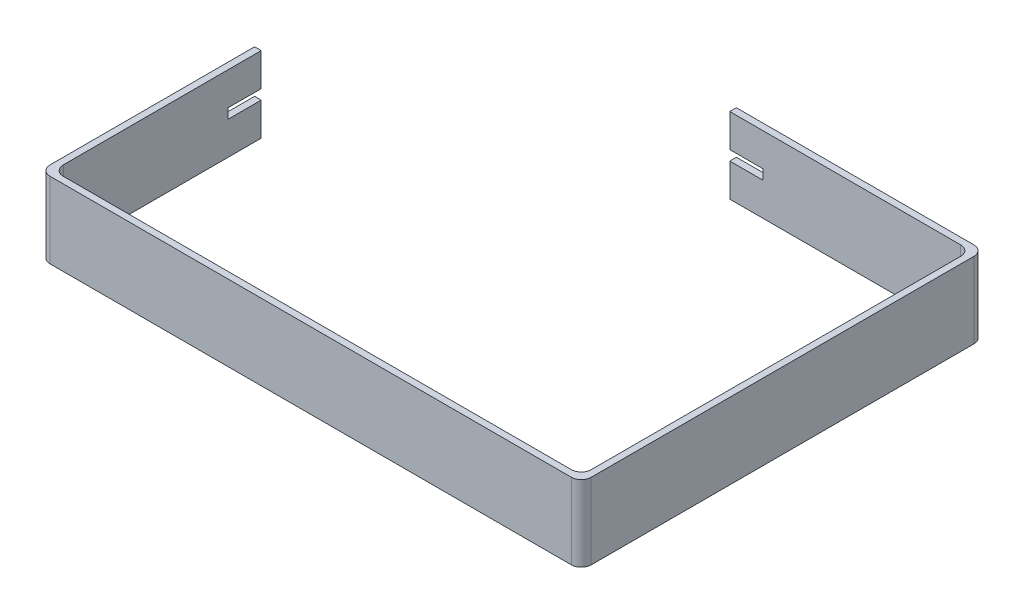
ISO-10303-21;
HEADER;
FILE_DESCRIPTION(('STEP AP214'),'2;1');
FILE_NAME('part.step','',(''),(''),'','','');
FILE_SCHEMA(('AUTOMOTIVE_DESIGN { 1 0 10303 214 1 1 1 1 }'));
ENDSEC;
DATA;
#1=APPLICATION_CONTEXT('core data for automotive mechanical design processes');
#2=APPLICATION_PROTOCOL_DEFINITION('international standard','automotive_design',2000,#1);
#3=PRODUCT_CONTEXT('',#1,'mechanical');
#4=PRODUCT('Part','Part','',(#3));
#5=PRODUCT_RELATED_PRODUCT_CATEGORY('part','',(#4));
#6=PRODUCT_DEFINITION_FORMATION('','',#4);
#7=PRODUCT_DEFINITION_CONTEXT('part definition',#1,'design');
#8=PRODUCT_DEFINITION('design','',#6,#7);
#9=PRODUCT_DEFINITION_SHAPE('','',#8);
#10=(LENGTH_UNIT() NAMED_UNIT(*) SI_UNIT(.MILLI.,.METRE.));
#11=(NAMED_UNIT(*) PLANE_ANGLE_UNIT() SI_UNIT($,.RADIAN.));
#12=(NAMED_UNIT(*) SI_UNIT($,.STERADIAN.) SOLID_ANGLE_UNIT());
#13=UNCERTAINTY_MEASURE_WITH_UNIT(LENGTH_MEASURE(1.E-05),#10,'distance_accuracy_value','');
#14=(GEOMETRIC_REPRESENTATION_CONTEXT(3) GLOBAL_UNCERTAINTY_ASSIGNED_CONTEXT((#13)) GLOBAL_UNIT_ASSIGNED_CONTEXT((#10,
#11,#12)) REPRESENTATION_CONTEXT('',''));
#15=CARTESIAN_POINT('',(0.,0.,0.));
#16=DIRECTION('',(0.,0.,1.));
#17=DIRECTION('',(1.,0.,0.));
#18=AXIS2_PLACEMENT_3D('',#15,#16,#17);
#19=CARTESIAN_POINT('',(7.00000000000001,1.50000000000001,-120.));
#20=DIRECTION('',(0.,1.,0.));
#21=DIRECTION('',(-1.,0.,0.));
#22=AXIS2_PLACEMENT_3D('',#19,#20,#21);
#23=PLANE('',#22);
#24=DIRECTION('',(0.,0.,1.));
#25=VECTOR('',#24,1.);
#26=CARTESIAN_POINT('',(7.00000000000001,1.50000000000001,-120.));
#27=LINE('',#26,#25);
#28=CARTESIAN_POINT('',(7.00000000000001,1.50000000000001,-118.));
#29=VERTEX_POINT('',#28);
#30=CARTESIAN_POINT('',(7.00000000000001,1.50000000000001,-120.));
#31=VERTEX_POINT('',#30);
#32=EDGE_CURVE('E309',#29,#31,#27,.F.);
#33=ORIENTED_EDGE('',*,*,#32,.T.);
#34=DIRECTION('',(1.,0.,0.));
#35=VECTOR('',#34,1.);
#36=CARTESIAN_POINT('',(0.,1.50000000000001,-120.));
#37=LINE('',#36,#35);
#38=CARTESIAN_POINT('',(17.,1.50000000000001,-120.));
#39=VERTEX_POINT('',#38);
#40=EDGE_CURVE('E184',#31,#39,#37,.T.);
#41=ORIENTED_EDGE('',*,*,#40,.T.);
#42=DIRECTION('',(0.,0.,-1.));
#43=VECTOR('',#42,1.);
#44=CARTESIAN_POINT('',(17.,1.50000000000001,-120.));
#45=LINE('',#44,#43);
#46=CARTESIAN_POINT('',(17.,1.50000000000001,-118.));
#47=VERTEX_POINT('',#46);
#48=EDGE_CURVE('E177',#39,#47,#45,.F.);
#49=ORIENTED_EDGE('',*,*,#48,.T.);
#50=DIRECTION('',(1.,0.,0.));
#51=VECTOR('',#50,1.);
#52=CARTESIAN_POINT('',(0.,1.50000000000001,-118.));
#53=LINE('',#52,#51);
#54=EDGE_CURVE('E181',#29,#47,#53,.T.);
#55=ORIENTED_EDGE('',*,*,#54,.F.);
#56=EDGE_LOOP('',(#33,#41,#49,#55));
#57=FACE_BOUND('',#56,.T.);
#58=ADVANCED_FACE('F17',(#57),#23,.F.);
#59=CARTESIAN_POINT('',(17.,1.50000000000001,-120.));
#60=DIRECTION('',(1.,0.,0.));
#61=DIRECTION('',(0.,0.,-1.));
#62=AXIS2_PLACEMENT_3D('',#59,#60,#61);
#63=PLANE('',#62);
#64=ORIENTED_EDGE('',*,*,#48,.F.);
#65=DIRECTION('',(0.,1.,0.));
#66=VECTOR('',#65,1.);
#67=CARTESIAN_POINT('',(17.,0.,-120.));
#68=LINE('',#67,#66);
#69=CARTESIAN_POINT('',(17.,-1.49999999999999,-120.));
#70=VERTEX_POINT('',#69);
#71=EDGE_CURVE('E394',#39,#70,#68,.F.);
#72=ORIENTED_EDGE('',*,*,#71,.T.);
#73=DIRECTION('',(0.,0.,1.));
#74=VECTOR('',#73,1.);
#75=CARTESIAN_POINT('',(17.,-1.49999999999999,-120.));
#76=LINE('',#75,#74);
#77=CARTESIAN_POINT('',(17.,-1.49999999999999,-118.));
#78=VERTEX_POINT('',#77);
#79=EDGE_CURVE('E187',#70,#78,#76,.T.);
#80=ORIENTED_EDGE('',*,*,#79,.T.);
#81=DIRECTION('',(0.,1.,0.));
#82=VECTOR('',#81,1.);
#83=CARTESIAN_POINT('',(17.,0.,-118.));
#84=LINE('',#83,#82);
#85=EDGE_CURVE('E190',#47,#78,#84,.F.);
#86=ORIENTED_EDGE('',*,*,#85,.F.);
#87=EDGE_LOOP('',(#64,#72,#80,#86));
#88=FACE_BOUND('',#87,.T.);
#89=ADVANCED_FACE('F191',(#88),#63,.F.);
#90=CARTESIAN_POINT('',(17.,-1.49999999999999,-120.));
#91=DIRECTION('',(0.,-1.,0.));
#92=DIRECTION('',(1.,0.,0.));
#93=AXIS2_PLACEMENT_3D('',#90,#91,#92);
#94=PLANE('',#93);
#95=ORIENTED_EDGE('',*,*,#79,.F.);
#96=DIRECTION('',(1.,0.,0.));
#97=VECTOR('',#96,1.);
#98=CARTESIAN_POINT('',(0.,-1.49999999999999,-120.));
#99=LINE('',#98,#97);
#100=CARTESIAN_POINT('',(7.,-1.49999999999999,-120.));
#101=VERTEX_POINT('',#100);
#102=EDGE_CURVE('E337',#70,#101,#99,.F.);
#103=ORIENTED_EDGE('',*,*,#102,.T.);
#104=DIRECTION('',(0.,0.,1.));
#105=VECTOR('',#104,1.);
#106=CARTESIAN_POINT('',(7.,-1.49999999999999,-120.));
#107=LINE('',#106,#105);
#108=CARTESIAN_POINT('',(7.,-1.49999999999999,-118.));
#109=VERTEX_POINT('',#108);
#110=EDGE_CURVE('E363',#101,#109,#107,.T.);
#111=ORIENTED_EDGE('',*,*,#110,.T.);
#112=DIRECTION('',(1.,0.,0.));
#113=VECTOR('',#112,1.);
#114=CARTESIAN_POINT('',(0.,-1.49999999999999,-118.));
#115=LINE('',#114,#113);
#116=EDGE_CURVE('E196',#78,#109,#115,.F.);
#117=ORIENTED_EDGE('',*,*,#116,.F.);
#118=EDGE_LOOP('',(#95,#103,#111,#117));
#119=FACE_BOUND('',#118,.T.);
#120=ADVANCED_FACE('F417',(#119),#94,.F.);
#121=CARTESIAN_POINT('',(-82.,1.49999999999999,-63.));
#122=DIRECTION('',(0.,1.,0.));
#123=DIRECTION('',(0.,0.,1.));
#124=AXIS2_PLACEMENT_3D('',#121,#122,#123);
#125=PLANE('',#124);
#126=DIRECTION('',(1.,0.,0.));
#127=VECTOR('',#126,1.);
#128=CARTESIAN_POINT('',(-82.,1.49999999999999,-53.));
#129=LINE('',#128,#127);
#130=CARTESIAN_POINT('',(-80.,1.49999999999999,-53.));
#131=VERTEX_POINT('',#130);
#132=CARTESIAN_POINT('',(-82.,1.49999999999999,-53.));
#133=VERTEX_POINT('',#132);
#134=EDGE_CURVE('E373',#131,#133,#129,.F.);
#135=ORIENTED_EDGE('',*,*,#134,.T.);
#136=DIRECTION('',(0.,0.,1.));
#137=VECTOR('',#136,1.);
#138=CARTESIAN_POINT('',(-82.,1.49999999999999,0.));
#139=LINE('',#138,#137);
#140=CARTESIAN_POINT('',(-82.,1.49999999999999,-63.));
#141=VERTEX_POINT('',#140);
#142=EDGE_CURVE('E332',#141,#133,#139,.T.);
#143=ORIENTED_EDGE('',*,*,#142,.F.);
#144=DIRECTION('',(1.,0.,0.));
#145=VECTOR('',#144,1.);
#146=CARTESIAN_POINT('',(-82.,1.49999999999999,-63.));
#147=LINE('',#146,#145);
#148=CARTESIAN_POINT('',(-80.,1.49999999999999,-63.));
#149=VERTEX_POINT('',#148);
#150=EDGE_CURVE('E323',#141,#149,#147,.T.);
#151=ORIENTED_EDGE('',*,*,#150,.T.);
#152=DIRECTION('',(0.,0.,1.));
#153=VECTOR('',#152,1.);
#154=CARTESIAN_POINT('',(-80.,1.49999999999999,0.));
#155=LINE('',#154,#153);
#156=EDGE_CURVE('E225',#149,#131,#155,.T.);
#157=ORIENTED_EDGE('',*,*,#156,.T.);
#158=EDGE_LOOP('',(#135,#143,#151,#157));
#159=FACE_BOUND('',#158,.T.);
#160=ADVANCED_FACE('F498',(#159),#125,.F.);
#161=CARTESIAN_POINT('',(-82.,1.49999999999999,-53.));
#162=DIRECTION('',(0.,0.,1.));
#163=DIRECTION('',(1.,0.,0.));
#164=AXIS2_PLACEMENT_3D('',#161,#162,#163);
#165=PLANE('',#164);
#166=DIRECTION('',(1.,0.,0.));
#167=VECTOR('',#166,1.);
#168=CARTESIAN_POINT('',(-82.,-1.50000000000001,-53.));
#169=LINE('',#168,#167);
#170=CARTESIAN_POINT('',(-80.,-1.50000000000001,-53.));
#171=VERTEX_POINT('',#170);
#172=CARTESIAN_POINT('',(-82.,-1.50000000000001,-53.));
#173=VERTEX_POINT('',#172);
#174=EDGE_CURVE('E371',#171,#173,#169,.F.);
#175=ORIENTED_EDGE('',*,*,#174,.T.);
#176=DIRECTION('',(0.,1.,0.));
#177=VECTOR('',#176,1.);
#178=CARTESIAN_POINT('',(-82.,0.,-53.));
#179=LINE('',#178,#177);
#180=EDGE_CURVE('E368',#133,#173,#179,.F.);
#181=ORIENTED_EDGE('',*,*,#180,.F.);
#182=ORIENTED_EDGE('',*,*,#134,.F.);
#183=DIRECTION('',(0.,1.,0.));
#184=VECTOR('',#183,1.);
#185=CARTESIAN_POINT('',(-80.,0.,-53.));
#186=LINE('',#185,#184);
#187=EDGE_CURVE('E221',#131,#171,#186,.F.);
#188=ORIENTED_EDGE('',*,*,#187,.T.);
#189=EDGE_LOOP('',(#175,#181,#182,#188));
#190=FACE_BOUND('',#189,.T.);
#191=ADVANCED_FACE('F495',(#190),#165,.F.);
#192=CARTESIAN_POINT('',(-82.,-1.50000000000001,-53.));
#193=DIRECTION('',(0.,-1.,0.));
#194=DIRECTION('',(0.,0.,-1.));
#195=AXIS2_PLACEMENT_3D('',#192,#193,#194);
#196=PLANE('',#195);
#197=DIRECTION('',(1.,0.,0.));
#198=VECTOR('',#197,1.);
#199=CARTESIAN_POINT('',(-82.,-1.50000000000001,-63.));
#200=LINE('',#199,#198);
#201=CARTESIAN_POINT('',(-80.,-1.50000000000001,-63.));
#202=VERTEX_POINT('',#201);
#203=CARTESIAN_POINT('',(-82.,-1.50000000000001,-63.));
#204=VERTEX_POINT('',#203);
#205=EDGE_CURVE('E361',#202,#204,#200,.F.);
#206=ORIENTED_EDGE('',*,*,#205,.T.);
#207=DIRECTION('',(0.,0.,1.));
#208=VECTOR('',#207,1.);
#209=CARTESIAN_POINT('',(-82.,-1.50000000000001,0.));
#210=LINE('',#209,#208);
#211=EDGE_CURVE('E346',#173,#204,#210,.F.);
#212=ORIENTED_EDGE('',*,*,#211,.F.);
#213=ORIENTED_EDGE('',*,*,#174,.F.);
#214=DIRECTION('',(0.,0.,1.));
#215=VECTOR('',#214,1.);
#216=CARTESIAN_POINT('',(-80.,-1.50000000000001,0.));
#217=LINE('',#216,#215);
#218=EDGE_CURVE('E218',#171,#202,#217,.F.);
#219=ORIENTED_EDGE('',*,*,#218,.T.);
#220=EDGE_LOOP('',(#206,#212,#213,#219));
#221=FACE_BOUND('',#220,.T.);
#222=ADVANCED_FACE('F489',(#221),#196,.F.);
#223=CARTESIAN_POINT('',(7.,-1.49999999999999,-120.));
#224=DIRECTION('',(1.,0.,0.));
#225=DIRECTION('',(0.,1.,0.));
#226=AXIS2_PLACEMENT_3D('',#223,#224,#225);
#227=PLANE('',#226);
#228=ORIENTED_EDGE('',*,*,#110,.F.);
#229=DIRECTION('',(0.,1.,0.));
#230=VECTOR('',#229,1.);
#231=CARTESIAN_POINT('',(7.,0.,-120.));
#232=LINE('',#231,#230);
#233=CARTESIAN_POINT('',(7.00000000000001,-11.5,-120.));
#234=VERTEX_POINT('',#233);
#235=EDGE_CURVE('E297',#101,#234,#232,.F.);
#236=ORIENTED_EDGE('',*,*,#235,.T.);
#237=DIRECTION('',(0.,0.,1.));
#238=VECTOR('',#237,1.);
#239=CARTESIAN_POINT('',(7.00000000000001,-11.5,2.));
#240=LINE('',#239,#238);
#241=CARTESIAN_POINT('',(7.00000000000001,-11.5,-118.));
#242=VERTEX_POINT('',#241);
#243=EDGE_CURVE('E123',#234,#242,#240,.T.);
#244=ORIENTED_EDGE('',*,*,#243,.T.);
#245=DIRECTION('',(0.,1.,0.));
#246=VECTOR('',#245,1.);
#247=CARTESIAN_POINT('',(7.,0.,-118.));
#248=LINE('',#247,#246);
#249=EDGE_CURVE('E213',#109,#242,#248,.F.);
#250=ORIENTED_EDGE('',*,*,#249,.F.);
#251=EDGE_LOOP('',(#228,#236,#244,#250));
#252=FACE_BOUND('',#251,.T.);
#253=ADVANCED_FACE('F676',(#252),#227,.F.);
#254=CARTESIAN_POINT('',(-82.,-1.50000000000001,-63.));
#255=DIRECTION('',(0.,0.,1.));
#256=DIRECTION('',(1.,0.,0.));
#257=AXIS2_PLACEMENT_3D('',#254,#255,#256);
#258=PLANE('',#257);
#259=DIRECTION('',(1.,0.,0.));
#260=VECTOR('',#259,1.);
#261=CARTESIAN_POINT('',(-80.,-11.5,-63.));
#262=LINE('',#261,#260);
#263=CARTESIAN_POINT('',(-80.,-11.5,-63.));
#264=VERTEX_POINT('',#263);
#265=CARTESIAN_POINT('',(-82.,-11.5,-63.));
#266=VERTEX_POINT('',#265);
#267=EDGE_CURVE('E349',#264,#266,#262,.F.);
#268=ORIENTED_EDGE('',*,*,#267,.T.);
#269=DIRECTION('',(0.,1.,0.));
#270=VECTOR('',#269,1.);
#271=CARTESIAN_POINT('',(-82.,0.,-63.));
#272=LINE('',#271,#270);
#273=EDGE_CURVE('E341',#204,#266,#272,.F.);
#274=ORIENTED_EDGE('',*,*,#273,.F.);
#275=ORIENTED_EDGE('',*,*,#205,.F.);
#276=DIRECTION('',(0.,1.,0.));
#277=VECTOR('',#276,1.);
#278=CARTESIAN_POINT('',(-80.,0.,-63.));
#279=LINE('',#278,#277);
#280=EDGE_CURVE('E220',#202,#264,#279,.F.);
#281=ORIENTED_EDGE('',*,*,#280,.T.);
#282=EDGE_LOOP('',(#268,#274,#275,#281));
#283=FACE_BOUND('',#282,.T.);
#284=ADVANCED_FACE('F479',(#283),#258,.F.);
#285=CARTESIAN_POINT('',(-82.,11.5,-63.));
#286=DIRECTION('',(0.,0.,1.));
#287=DIRECTION('',(1.,0.,0.));
#288=AXIS2_PLACEMENT_3D('',#285,#286,#287);
#289=PLANE('',#288);
#290=ORIENTED_EDGE('',*,*,#150,.F.);
#291=DIRECTION('',(0.,1.,0.));
#292=VECTOR('',#291,1.);
#293=CARTESIAN_POINT('',(-82.,0.,-63.));
#294=LINE('',#293,#292);
#295=CARTESIAN_POINT('',(-82.,11.5,-63.));
#296=VERTEX_POINT('',#295);
#297=EDGE_CURVE('E293',#296,#141,#294,.F.);
#298=ORIENTED_EDGE('',*,*,#297,.F.);
#299=DIRECTION('',(1.,0.,0.));
#300=VECTOR('',#299,1.);
#301=CARTESIAN_POINT('',(-80.,11.5,-63.));
#302=LINE('',#301,#300);
#303=CARTESIAN_POINT('',(-80.,11.5,-63.));
#304=VERTEX_POINT('',#303);
#305=EDGE_CURVE('E326',#296,#304,#302,.T.);
#306=ORIENTED_EDGE('',*,*,#305,.T.);
#307=DIRECTION('',(0.,1.,0.));
#308=VECTOR('',#307,1.);
#309=CARTESIAN_POINT('',(-80.,0.,-63.));
#310=LINE('',#309,#308);
#311=EDGE_CURVE('E229',#304,#149,#310,.F.);
#312=ORIENTED_EDGE('',*,*,#311,.T.);
#313=EDGE_LOOP('',(#290,#298,#306,#312));
#314=FACE_BOUND('',#313,.T.);
#315=ADVANCED_FACE('F501',(#314),#289,.F.);
#316=CARTESIAN_POINT('',(-80.,0.,0.));
#317=DIRECTION('',(-1.,0.,0.));
#318=DIRECTION('',(0.,0.,1.));
#319=AXIS2_PLACEMENT_3D('',#316,#317,#318);
#320=PLANE('',#319);
#321=DIRECTION('',(0.,1.,0.));
#322=VECTOR('',#321,1.);
#323=CARTESIAN_POINT('',(-80.,0.,-3.));
#324=LINE('',#323,#322);
#325=CARTESIAN_POINT('',(-80.,11.5,-3.));
#326=VERTEX_POINT('',#325);
#327=CARTESIAN_POINT('',(-80.,-11.5,-3.));
#328=VERTEX_POINT('',#327);
#329=EDGE_CURVE('E319',#326,#328,#324,.F.);
#330=ORIENTED_EDGE('',*,*,#329,.T.);
#331=DIRECTION('',(0.,0.,1.));
#332=VECTOR('',#331,1.);
#333=CARTESIAN_POINT('',(-80.,-11.5,2.));
#334=LINE('',#333,#332);
#335=EDGE_CURVE('E265',#328,#264,#334,.F.);
#336=ORIENTED_EDGE('',*,*,#335,.T.);
#337=ORIENTED_EDGE('',*,*,#280,.F.);
#338=ORIENTED_EDGE('',*,*,#218,.F.);
#339=ORIENTED_EDGE('',*,*,#187,.F.);
#340=ORIENTED_EDGE('',*,*,#156,.F.);
#341=ORIENTED_EDGE('',*,*,#311,.F.);
#342=DIRECTION('',(0.,0.,-1.));
#343=VECTOR('',#342,1.);
#344=CARTESIAN_POINT('',(-80.,11.5,2.));
#345=LINE('',#344,#343);
#346=EDGE_CURVE('E250',#304,#326,#345,.F.);
#347=ORIENTED_EDGE('',*,*,#346,.T.);
#348=EDGE_LOOP('',(#330,#336,#337,#338,#339,#340,#341,#347));
#349=FACE_BOUND('',#348,.T.);
#350=ADVANCED_FACE('F471',(#349),#320,.F.);
#351=CARTESIAN_POINT('',(-77.,0.,-3.));
#352=DIRECTION('',(0.,1.,0.));
#353=DIRECTION('',(0.,0.,1.));
#354=AXIS2_PLACEMENT_3D('',#351,#352,#353);
#355=CYLINDRICAL_SURFACE('',#354,3.);
#356=DIRECTION('',(0.,1.,0.));
#357=VECTOR('',#356,1.);
#358=CARTESIAN_POINT('',(-77.,0.,0.));
#359=LINE('',#358,#357);
#360=CARTESIAN_POINT('',(-77.,11.5,0.));
#361=VERTEX_POINT('',#360);
#362=CARTESIAN_POINT('',(-77.,-11.5,0.));
#363=VERTEX_POINT('',#362);
#364=EDGE_CURVE('E317',#361,#363,#359,.F.);
#365=ORIENTED_EDGE('',*,*,#364,.T.);
#366=CARTESIAN_POINT('',(-77.,-11.5,-3.));
#367=DIRECTION('',(0.,1.,0.));
#368=DIRECTION('',(0.,0.,1.));
#369=AXIS2_PLACEMENT_3D('',#366,#367,#368);
#370=CIRCLE('',#369,3.);
#371=EDGE_CURVE('E263',#363,#328,#370,.F.);
#372=ORIENTED_EDGE('',*,*,#371,.T.);
#373=ORIENTED_EDGE('',*,*,#329,.F.);
#374=CARTESIAN_POINT('',(-77.,11.5,-3.));
#375=DIRECTION('',(0.,1.,0.));
#376=DIRECTION('',(0.,0.,1.));
#377=AXIS2_PLACEMENT_3D('',#374,#375,#376);
#378=CIRCLE('',#377,3.);
#379=EDGE_CURVE('E248',#326,#361,#378,.T.);
#380=ORIENTED_EDGE('',*,*,#379,.T.);
#381=EDGE_LOOP('',(#365,#372,#373,#380));
#382=FACE_BOUND('',#381,.T.);
#383=ADVANCED_FACE('F508',(#382),#355,.F.);
#384=CARTESIAN_POINT('',(0.,0.,0.));
#385=DIRECTION('',(0.,0.,1.));
#386=DIRECTION('',(1.,0.,0.));
#387=AXIS2_PLACEMENT_3D('',#384,#385,#386);
#388=PLANE('',#387);
#389=DIRECTION('',(0.,-1.,0.));
#390=VECTOR('',#389,1.);
#391=CARTESIAN_POINT('',(77.,0.,0.));
#392=LINE('',#391,#390);
#393=CARTESIAN_POINT('',(77.,11.5,0.));
#394=VERTEX_POINT('',#393);
#395=CARTESIAN_POINT('',(77.,-11.5,0.));
#396=VERTEX_POINT('',#395);
#397=EDGE_CURVE('E315',#394,#396,#392,.T.);
#398=ORIENTED_EDGE('',*,*,#397,.T.);
#399=DIRECTION('',(1.,0.,0.));
#400=VECTOR('',#399,1.);
#401=CARTESIAN_POINT('',(-80.,-11.5,0.));
#402=LINE('',#401,#400);
#403=EDGE_CURVE('E266',#396,#363,#402,.F.);
#404=ORIENTED_EDGE('',*,*,#403,.T.);
#405=ORIENTED_EDGE('',*,*,#364,.F.);
#406=DIRECTION('',(1.,0.,0.));
#407=VECTOR('',#406,1.);
#408=CARTESIAN_POINT('',(-80.,11.5,0.));
#409=LINE('',#408,#407);
#410=EDGE_CURVE('E247',#361,#394,#409,.T.);
#411=ORIENTED_EDGE('',*,*,#410,.T.);
#412=EDGE_LOOP('',(#398,#404,#405,#411));
#413=FACE_BOUND('',#412,.T.);
#414=ADVANCED_FACE('F510',(#413),#388,.F.);
#415=CARTESIAN_POINT('',(77.,0.,-3.));
#416=DIRECTION('',(0.,-1.,0.));
#417=DIRECTION('',(0.,0.,-1.));
#418=AXIS2_PLACEMENT_3D('',#415,#416,#417);
#419=CYLINDRICAL_SURFACE('',#418,3.);
#420=ORIENTED_EDGE('',*,*,#397,.F.);
#421=CARTESIAN_POINT('',(77.,11.5,-3.));
#422=DIRECTION('',(0.,-1.,0.));
#423=DIRECTION('',(0.,0.,-1.));
#424=AXIS2_PLACEMENT_3D('',#421,#422,#423);
#425=CIRCLE('',#424,3.);
#426=CARTESIAN_POINT('',(80.,11.5,-3.));
#427=VERTEX_POINT('',#426);
#428=EDGE_CURVE('E245',#394,#427,#425,.F.);
#429=ORIENTED_EDGE('',*,*,#428,.T.);
#430=DIRECTION('',(0.,1.,0.));
#431=VECTOR('',#430,1.);
#432=CARTESIAN_POINT('',(80.,0.,-3.));
#433=LINE('',#432,#431);
#434=CARTESIAN_POINT('',(80.,-11.5,-3.));
#435=VERTEX_POINT('',#434);
#436=EDGE_CURVE('E313',#427,#435,#433,.F.);
#437=ORIENTED_EDGE('',*,*,#436,.T.);
#438=CARTESIAN_POINT('',(77.,-11.5,-3.));
#439=DIRECTION('',(0.,-1.,0.));
#440=DIRECTION('',(0.,0.,-1.));
#441=AXIS2_PLACEMENT_3D('',#438,#439,#440);
#442=CIRCLE('',#441,3.);
#443=EDGE_CURVE('E267',#435,#396,#442,.T.);
#444=ORIENTED_EDGE('',*,*,#443,.T.);
#445=EDGE_LOOP('',(#420,#429,#437,#444));
#446=FACE_BOUND('',#445,.T.);
#447=ADVANCED_FACE('F511',(#446),#419,.F.);
#448=CARTESIAN_POINT('',(80.,0.,0.));
#449=DIRECTION('',(1.,0.,0.));
#450=DIRECTION('',(0.,0.,-1.));
#451=AXIS2_PLACEMENT_3D('',#448,#449,#450);
#452=PLANE('',#451);
#453=DIRECTION('',(0.,1.,0.));
#454=VECTOR('',#453,1.);
#455=CARTESIAN_POINT('',(80.,0.,-115.));
#456=LINE('',#455,#454);
#457=CARTESIAN_POINT('',(80.,11.5,-115.));
#458=VERTEX_POINT('',#457);
#459=CARTESIAN_POINT('',(80.,-11.5,-115.));
#460=VERTEX_POINT('',#459);
#461=EDGE_CURVE('E204',#458,#460,#456,.F.);
#462=ORIENTED_EDGE('',*,*,#461,.T.);
#463=DIRECTION('',(0.,0.,1.));
#464=VECTOR('',#463,1.);
#465=CARTESIAN_POINT('',(80.,-11.5,2.));
#466=LINE('',#465,#464);
#467=EDGE_CURVE('E269',#460,#435,#466,.T.);
#468=ORIENTED_EDGE('',*,*,#467,.T.);
#469=ORIENTED_EDGE('',*,*,#436,.F.);
#470=DIRECTION('',(0.,0.,-1.));
#471=VECTOR('',#470,1.);
#472=CARTESIAN_POINT('',(80.,11.5,2.));
#473=LINE('',#472,#471);
#474=EDGE_CURVE('E244',#427,#458,#473,.T.);
#475=ORIENTED_EDGE('',*,*,#474,.T.);
#476=EDGE_LOOP('',(#462,#468,#469,#475));
#477=FACE_BOUND('',#476,.T.);
#478=ADVANCED_FACE('F512',(#477),#452,.F.);
#479=CARTESIAN_POINT('',(77.,0.,-115.));
#480=DIRECTION('',(0.,1.,0.));
#481=DIRECTION('',(0.,0.,1.));
#482=AXIS2_PLACEMENT_3D('',#479,#480,#481);
#483=CYLINDRICAL_SURFACE('',#482,3.);
#484=ORIENTED_EDGE('',*,*,#461,.F.);
#485=CARTESIAN_POINT('',(77.,11.5,-115.));
#486=DIRECTION('',(0.,1.,0.));
#487=DIRECTION('',(0.,0.,1.));
#488=AXIS2_PLACEMENT_3D('',#485,#486,#487);
#489=CIRCLE('',#488,3.);
#490=CARTESIAN_POINT('',(77.,11.5,-118.));
#491=VERTEX_POINT('',#490);
#492=EDGE_CURVE('E241',#458,#491,#489,.T.);
#493=ORIENTED_EDGE('',*,*,#492,.T.);
#494=DIRECTION('',(0.,1.,0.));
#495=VECTOR('',#494,1.);
#496=CARTESIAN_POINT('',(77.,0.,-118.));
#497=LINE('',#496,#495);
#498=CARTESIAN_POINT('',(77.,-11.5,-118.));
#499=VERTEX_POINT('',#498);
#500=EDGE_CURVE('E113',#499,#491,#497,.T.);
#501=ORIENTED_EDGE('',*,*,#500,.F.);
#502=CARTESIAN_POINT('',(77.,-11.5,-115.));
#503=DIRECTION('',(0.,1.,0.));
#504=DIRECTION('',(0.,0.,1.));
#505=AXIS2_PLACEMENT_3D('',#502,#503,#504);
#506=CIRCLE('',#505,3.);
#507=EDGE_CURVE('E20',#499,#460,#506,.F.);
#508=ORIENTED_EDGE('',*,*,#507,.T.);
#509=EDGE_LOOP('',(#484,#493,#501,#508));
#510=FACE_BOUND('',#509,.T.);
#511=ADVANCED_FACE('F426',(#510),#483,.F.);
#512=CARTESIAN_POINT('',(0.,0.,-118.));
#513=DIRECTION('',(0.,0.,1.));
#514=DIRECTION('',(1.,0.,0.));
#515=AXIS2_PLACEMENT_3D('',#512,#513,#514);
#516=PLANE('',#515);
#517=ORIENTED_EDGE('',*,*,#116,.T.);
#518=ORIENTED_EDGE('',*,*,#249,.T.);
#519=DIRECTION('',(1.,0.,0.));
#520=VECTOR('',#519,1.);
#521=CARTESIAN_POINT('',(-80.,-11.5,-118.));
#522=LINE('',#521,#520);
#523=EDGE_CURVE('E281',#242,#499,#522,.T.);
#524=ORIENTED_EDGE('',*,*,#523,.T.);
#525=ORIENTED_EDGE('',*,*,#500,.T.);
#526=DIRECTION('',(1.,0.,0.));
#527=VECTOR('',#526,1.);
#528=CARTESIAN_POINT('',(-80.,11.5,-118.));
#529=LINE('',#528,#527);
#530=CARTESIAN_POINT('',(7.00000000000001,11.5,-118.));
#531=VERTEX_POINT('',#530);
#532=EDGE_CURVE('E243',#491,#531,#529,.F.);
#533=ORIENTED_EDGE('',*,*,#532,.T.);
#534=DIRECTION('',(0.,1.,0.));
#535=VECTOR('',#534,1.);
#536=CARTESIAN_POINT('',(7.00000000000001,11.5,-118.));
#537=LINE('',#536,#535);
#538=EDGE_CURVE('E201',#531,#29,#537,.F.);
#539=ORIENTED_EDGE('',*,*,#538,.T.);
#540=ORIENTED_EDGE('',*,*,#54,.T.);
#541=ORIENTED_EDGE('',*,*,#85,.T.);
#542=EDGE_LOOP('',(#517,#518,#524,#525,#533,#539,#540,#541));
#543=FACE_BOUND('',#542,.T.);
#544=ADVANCED_FACE('F198',(#543),#516,.T.);
#545=CARTESIAN_POINT('',(7.00000000000001,11.5,-120.));
#546=DIRECTION('',(1.,0.,0.));
#547=DIRECTION('',(0.,1.,0.));
#548=AXIS2_PLACEMENT_3D('',#545,#546,#547);
#549=PLANE('',#548);
#550=DIRECTION('',(0.,0.,-1.));
#551=VECTOR('',#550,1.);
#552=CARTESIAN_POINT('',(7.00000000000001,11.5,2.));
#553=LINE('',#552,#551);
#554=CARTESIAN_POINT('',(7.00000000000001,11.5,-120.));
#555=VERTEX_POINT('',#554);
#556=EDGE_CURVE('E303',#531,#555,#553,.T.);
#557=ORIENTED_EDGE('',*,*,#556,.T.);
#558=DIRECTION('',(0.,1.,0.));
#559=VECTOR('',#558,1.);
#560=CARTESIAN_POINT('',(7.00000000000001,0.,-120.));
#561=LINE('',#560,#559);
#562=EDGE_CURVE('E298',#555,#31,#561,.F.);
#563=ORIENTED_EDGE('',*,*,#562,.T.);
#564=ORIENTED_EDGE('',*,*,#32,.F.);
#565=ORIENTED_EDGE('',*,*,#538,.F.);
#566=EDGE_LOOP('',(#557,#563,#564,#565));
#567=FACE_BOUND('',#566,.T.);
#568=ADVANCED_FACE('F409',(#567),#549,.F.);
#569=CARTESIAN_POINT('',(0.,0.,-120.));
#570=DIRECTION('',(0.,0.,1.));
#571=DIRECTION('',(1.,0.,0.));
#572=AXIS2_PLACEMENT_3D('',#569,#570,#571);
#573=PLANE('',#572);
#574=DIRECTION('',(0.,1.,0.));
#575=VECTOR('',#574,1.);
#576=CARTESIAN_POINT('',(79.,0.,-120.));
#577=LINE('',#576,#575);
#578=CARTESIAN_POINT('',(79.,-11.5,-120.));
#579=VERTEX_POINT('',#578);
#580=CARTESIAN_POINT('',(79.,11.5,-120.));
#581=VERTEX_POINT('',#580);
#582=EDGE_CURVE('E294',#579,#581,#577,.T.);
#583=ORIENTED_EDGE('',*,*,#582,.F.);
#584=DIRECTION('',(1.,0.,0.));
#585=VECTOR('',#584,1.);
#586=CARTESIAN_POINT('',(-80.,-11.5,-120.));
#587=LINE('',#586,#585);
#588=EDGE_CURVE('E258',#579,#234,#587,.F.);
#589=ORIENTED_EDGE('',*,*,#588,.T.);
#590=ORIENTED_EDGE('',*,*,#235,.F.);
#591=ORIENTED_EDGE('',*,*,#102,.F.);
#592=ORIENTED_EDGE('',*,*,#71,.F.);
#593=ORIENTED_EDGE('',*,*,#40,.F.);
#594=ORIENTED_EDGE('',*,*,#562,.F.);
#595=DIRECTION('',(1.,0.,0.));
#596=VECTOR('',#595,1.);
#597=CARTESIAN_POINT('',(-80.,11.5,-120.));
#598=LINE('',#597,#596);
#599=EDGE_CURVE('E240',#555,#581,#598,.T.);
#600=ORIENTED_EDGE('',*,*,#599,.T.);
#601=EDGE_LOOP('',(#583,#589,#590,#591,#592,#593,#594,#600));
#602=FACE_BOUND('',#601,.T.);
#603=ADVANCED_FACE('F413',(#602),#573,.F.);
#604=CARTESIAN_POINT('',(79.,0.,-117.));
#605=DIRECTION('',(0.,1.,0.));
#606=DIRECTION('',(0.,0.,1.));
#607=AXIS2_PLACEMENT_3D('',#604,#605,#606);
#608=CYLINDRICAL_SURFACE('',#607,3.);
#609=CARTESIAN_POINT('',(79.,-11.5,-117.));
#610=DIRECTION('',(0.,1.,0.));
#611=DIRECTION('',(0.,0.,1.));
#612=AXIS2_PLACEMENT_3D('',#609,#610,#611);
#613=CIRCLE('',#612,3.);
#614=CARTESIAN_POINT('',(82.,-11.5,-117.));
#615=VERTEX_POINT('',#614);
#616=EDGE_CURVE('E259',#615,#579,#613,.T.);
#617=ORIENTED_EDGE('',*,*,#616,.T.);
#618=ORIENTED_EDGE('',*,*,#582,.T.);
#619=CARTESIAN_POINT('',(79.,11.5,-117.));
#620=DIRECTION('',(0.,1.,0.));
#621=DIRECTION('',(0.,0.,1.));
#622=AXIS2_PLACEMENT_3D('',#619,#620,#621);
#623=CIRCLE('',#622,3.);
#624=CARTESIAN_POINT('',(82.,11.5,-117.));
#625=VERTEX_POINT('',#624);
#626=EDGE_CURVE('E238',#581,#625,#623,.F.);
#627=ORIENTED_EDGE('',*,*,#626,.T.);
#628=DIRECTION('',(0.,1.,0.));
#629=VECTOR('',#628,1.);
#630=CARTESIAN_POINT('',(82.,0.,-117.));
#631=LINE('',#630,#629);
#632=EDGE_CURVE('E290',#615,#625,#631,.T.);
#633=ORIENTED_EDGE('',*,*,#632,.F.);
#634=EDGE_LOOP('',(#617,#618,#627,#633));
#635=FACE_BOUND('',#634,.T.);
#636=ADVANCED_FACE('F546',(#635),#608,.T.);
#637=CARTESIAN_POINT('',(82.,0.,0.));
#638=DIRECTION('',(1.,0.,0.));
#639=DIRECTION('',(0.,0.,-1.));
#640=AXIS2_PLACEMENT_3D('',#637,#638,#639);
#641=PLANE('',#640);
#642=DIRECTION('',(0.,0.,-1.));
#643=VECTOR('',#642,1.);
#644=CARTESIAN_POINT('',(82.,11.5,2.));
#645=LINE('',#644,#643);
#646=CARTESIAN_POINT('',(82.,11.5,-1.));
#647=VERTEX_POINT('',#646);
#648=EDGE_CURVE('E237',#625,#647,#645,.F.);
#649=ORIENTED_EDGE('',*,*,#648,.T.);
#650=DIRECTION('',(0.,-1.,0.));
#651=VECTOR('',#650,1.);
#652=CARTESIAN_POINT('',(82.,0.,-1.));
#653=LINE('',#652,#651);
#654=CARTESIAN_POINT('',(82.,-11.5,-1.));
#655=VERTEX_POINT('',#654);
#656=EDGE_CURVE('E254',#655,#647,#653,.F.);
#657=ORIENTED_EDGE('',*,*,#656,.F.);
#658=DIRECTION('',(0.,0.,1.));
#659=VECTOR('',#658,1.);
#660=CARTESIAN_POINT('',(82.,-11.5,2.));
#661=LINE('',#660,#659);
#662=EDGE_CURVE('E262',#655,#615,#661,.F.);
#663=ORIENTED_EDGE('',*,*,#662,.T.);
#664=ORIENTED_EDGE('',*,*,#632,.T.);
#665=EDGE_LOOP('',(#649,#657,#663,#664));
#666=FACE_BOUND('',#665,.T.);
#667=ADVANCED_FACE('F543',(#666),#641,.T.);
#668=CARTESIAN_POINT('',(-82.,0.,0.));
#669=DIRECTION('',(-1.,0.,0.));
#670=DIRECTION('',(0.,0.,1.));
#671=AXIS2_PLACEMENT_3D('',#668,#669,#670);
#672=PLANE('',#671);
#673=ORIENTED_EDGE('',*,*,#211,.T.);
#674=ORIENTED_EDGE('',*,*,#273,.T.);
#675=DIRECTION('',(0.,0.,1.));
#676=VECTOR('',#675,1.);
#677=CARTESIAN_POINT('',(-82.,-11.5,2.));
#678=LINE('',#677,#676);
#679=CARTESIAN_POINT('',(-82.,-11.5,-1.));
#680=VERTEX_POINT('',#679);
#681=EDGE_CURVE('E352',#266,#680,#678,.T.);
#682=ORIENTED_EDGE('',*,*,#681,.T.);
#683=DIRECTION('',(0.,1.,0.));
#684=VECTOR('',#683,1.);
#685=CARTESIAN_POINT('',(-82.,0.,-1.));
#686=LINE('',#685,#684);
#687=CARTESIAN_POINT('',(-82.,11.5,-1.));
#688=VERTEX_POINT('',#687);
#689=EDGE_CURVE('E233',#688,#680,#686,.F.);
#690=ORIENTED_EDGE('',*,*,#689,.F.);
#691=DIRECTION('',(0.,0.,-1.));
#692=VECTOR('',#691,1.);
#693=CARTESIAN_POINT('',(-82.,11.5,2.));
#694=LINE('',#693,#692);
#695=EDGE_CURVE('E253',#688,#296,#694,.T.);
#696=ORIENTED_EDGE('',*,*,#695,.T.);
#697=ORIENTED_EDGE('',*,*,#297,.T.);
#698=ORIENTED_EDGE('',*,*,#142,.T.);
#699=ORIENTED_EDGE('',*,*,#180,.T.);
#700=EDGE_LOOP('',(#673,#674,#682,#690,#696,#697,#698,#699));
#701=FACE_BOUND('',#700,.T.);
#702=ADVANCED_FACE('F483',(#701),#672,.T.);
#703=CARTESIAN_POINT('',(-80.,-11.5,2.));
#704=DIRECTION('',(0.,1.,0.));
#705=DIRECTION('',(0.,0.,1.));
#706=AXIS2_PLACEMENT_3D('',#703,#704,#705);
#707=PLANE('',#706);
#708=ORIENTED_EDGE('',*,*,#616,.F.);
#709=ORIENTED_EDGE('',*,*,#662,.F.);
#710=CARTESIAN_POINT('',(79.,-11.5,-1.));
#711=DIRECTION('',(0.,-1.,0.));
#712=DIRECTION('',(0.,0.,-1.));
#713=AXIS2_PLACEMENT_3D('',#710,#711,#712);
#714=CIRCLE('',#713,3.);
#715=CARTESIAN_POINT('',(79.,-11.5,2.));
#716=VERTEX_POINT('',#715);
#717=EDGE_CURVE('E255',#716,#655,#714,.F.);
#718=ORIENTED_EDGE('',*,*,#717,.F.);
#719=DIRECTION('',(1.,0.,0.));
#720=VECTOR('',#719,1.);
#721=CARTESIAN_POINT('',(0.,-11.5,2.));
#722=LINE('',#721,#720);
#723=CARTESIAN_POINT('',(-79.,-11.5,2.));
#724=VERTEX_POINT('',#723);
#725=EDGE_CURVE('E289',#724,#716,#722,.T.);
#726=ORIENTED_EDGE('',*,*,#725,.F.);
#727=CARTESIAN_POINT('',(-79.,-11.5,-1.));
#728=DIRECTION('',(0.,1.,0.));
#729=DIRECTION('',(0.,0.,1.));
#730=AXIS2_PLACEMENT_3D('',#727,#728,#729);
#731=CIRCLE('',#730,3.);
#732=EDGE_CURVE('E234',#680,#724,#731,.T.);
#733=ORIENTED_EDGE('',*,*,#732,.F.);
#734=ORIENTED_EDGE('',*,*,#681,.F.);
#735=ORIENTED_EDGE('',*,*,#267,.F.);
#736=ORIENTED_EDGE('',*,*,#335,.F.);
#737=ORIENTED_EDGE('',*,*,#371,.F.);
#738=ORIENTED_EDGE('',*,*,#403,.F.);
#739=ORIENTED_EDGE('',*,*,#443,.F.);
#740=ORIENTED_EDGE('',*,*,#467,.F.);
#741=ORIENTED_EDGE('',*,*,#507,.F.);
#742=ORIENTED_EDGE('',*,*,#523,.F.);
#743=ORIENTED_EDGE('',*,*,#243,.F.);
#744=ORIENTED_EDGE('',*,*,#588,.F.);
#745=EDGE_LOOP('',(#708,#709,#718,#726,#733,#734,#735,#736,#737,#738,#739,#740,#741,#742,#743,#744));
#746=FACE_BOUND('',#745,.T.);
#747=ADVANCED_FACE('F423',(#746),#707,.F.);
#748=CARTESIAN_POINT('',(79.,0.,-1.));
#749=DIRECTION('',(0.,-1.,0.));
#750=DIRECTION('',(0.,0.,-1.));
#751=AXIS2_PLACEMENT_3D('',#748,#749,#750);
#752=CYLINDRICAL_SURFACE('',#751,3.);
#753=ORIENTED_EDGE('',*,*,#717,.T.);
#754=ORIENTED_EDGE('',*,*,#656,.T.);
#755=CARTESIAN_POINT('',(79.,11.5,-1.));
#756=DIRECTION('',(0.,-1.,0.));
#757=DIRECTION('',(0.,0.,-1.));
#758=AXIS2_PLACEMENT_3D('',#755,#756,#757);
#759=CIRCLE('',#758,3.);
#760=CARTESIAN_POINT('',(79.,11.5,2.));
#761=VERTEX_POINT('',#760);
#762=EDGE_CURVE('E251',#647,#761,#759,.T.);
#763=ORIENTED_EDGE('',*,*,#762,.T.);
#764=DIRECTION('',(0.,1.,0.));
#765=VECTOR('',#764,1.);
#766=CARTESIAN_POINT('',(79.,0.,2.));
#767=LINE('',#766,#765);
#768=EDGE_CURVE('E449',#716,#761,#767,.T.);
#769=ORIENTED_EDGE('',*,*,#768,.F.);
#770=EDGE_LOOP('',(#753,#754,#763,#769));
#771=FACE_BOUND('',#770,.T.);
#772=ADVANCED_FACE('F535',(#771),#752,.T.);
#773=CARTESIAN_POINT('',(-80.,11.5,2.));
#774=DIRECTION('',(0.,-1.,0.));
#775=DIRECTION('',(0.,0.,-1.));
#776=AXIS2_PLACEMENT_3D('',#773,#774,#775);
#777=PLANE('',#776);
#778=ORIENTED_EDGE('',*,*,#626,.F.);
#779=ORIENTED_EDGE('',*,*,#599,.F.);
#780=ORIENTED_EDGE('',*,*,#556,.F.);
#781=ORIENTED_EDGE('',*,*,#532,.F.);
#782=ORIENTED_EDGE('',*,*,#492,.F.);
#783=ORIENTED_EDGE('',*,*,#474,.F.);
#784=ORIENTED_EDGE('',*,*,#428,.F.);
#785=ORIENTED_EDGE('',*,*,#410,.F.);
#786=ORIENTED_EDGE('',*,*,#379,.F.);
#787=ORIENTED_EDGE('',*,*,#346,.F.);
#788=ORIENTED_EDGE('',*,*,#305,.F.);
#789=ORIENTED_EDGE('',*,*,#695,.F.);
#790=CARTESIAN_POINT('',(-79.,11.5,-1.));
#791=DIRECTION('',(0.,1.,0.));
#792=DIRECTION('',(0.,0.,1.));
#793=AXIS2_PLACEMENT_3D('',#790,#791,#792);
#794=CIRCLE('',#793,3.);
#795=CARTESIAN_POINT('',(-79.,11.5,2.));
#796=VERTEX_POINT('',#795);
#797=EDGE_CURVE('E35',#796,#688,#794,.F.);
#798=ORIENTED_EDGE('',*,*,#797,.F.);
#799=DIRECTION('',(1.,0.,0.));
#800=VECTOR('',#799,1.);
#801=CARTESIAN_POINT('',(0.,11.5,2.));
#802=LINE('',#801,#800);
#803=EDGE_CURVE('E26',#761,#796,#802,.F.);
#804=ORIENTED_EDGE('',*,*,#803,.F.);
#805=ORIENTED_EDGE('',*,*,#762,.F.);
#806=ORIENTED_EDGE('',*,*,#648,.F.);
#807=EDGE_LOOP('',(#778,#779,#780,#781,#782,#783,#784,#785,#786,#787,#788,#789,#798,#804,#805,#806));
#808=FACE_BOUND('',#807,.T.);
#809=ADVANCED_FACE('F431',(#808),#777,.F.);
#810=CARTESIAN_POINT('',(-79.,0.,-1.));
#811=DIRECTION('',(0.,1.,0.));
#812=DIRECTION('',(0.,0.,1.));
#813=AXIS2_PLACEMENT_3D('',#810,#811,#812);
#814=CYLINDRICAL_SURFACE('',#813,3.);
#815=ORIENTED_EDGE('',*,*,#797,.T.);
#816=ORIENTED_EDGE('',*,*,#689,.T.);
#817=ORIENTED_EDGE('',*,*,#732,.T.);
#818=DIRECTION('',(0.,1.,0.));
#819=VECTOR('',#818,1.);
#820=CARTESIAN_POINT('',(-79.,0.,2.));
#821=LINE('',#820,#819);
#822=EDGE_CURVE('E11',#796,#724,#821,.F.);
#823=ORIENTED_EDGE('',*,*,#822,.F.);
#824=EDGE_LOOP('',(#815,#816,#817,#823));
#825=FACE_BOUND('',#824,.T.);
#826=ADVANCED_FACE('F524',(#825),#814,.T.);
#827=CARTESIAN_POINT('',(0.,0.,2.));
#828=DIRECTION('',(0.,0.,1.));
#829=DIRECTION('',(1.,0.,0.));
#830=AXIS2_PLACEMENT_3D('',#827,#828,#829);
#831=PLANE('',#830);
#832=ORIENTED_EDGE('',*,*,#803,.T.);
#833=ORIENTED_EDGE('',*,*,#822,.T.);
#834=ORIENTED_EDGE('',*,*,#725,.T.);
#835=ORIENTED_EDGE('',*,*,#768,.T.);
#836=EDGE_LOOP('',(#832,#833,#834,#835));
#837=FACE_BOUND('',#836,.T.);
#838=ADVANCED_FACE('F522',(#837),#831,.T.);
#839=CLOSED_SHELL('',(#58,#89,#120,#160,#191,#222,#253,#284,#315,#350,#383,#414,#447,#478,#511,
#544,#568,#603,#636,#667,#702,#747,#772,#809,#826,#838));
#840=MANIFOLD_SOLID_BREP('B1',#839);
#841=ADVANCED_BREP_SHAPE_REPRESENTATION('',(#18,#840),#14);
#842=SHAPE_DEFINITION_REPRESENTATION(#9,#841);
ENDSEC;
END-ISO-10303-21;
